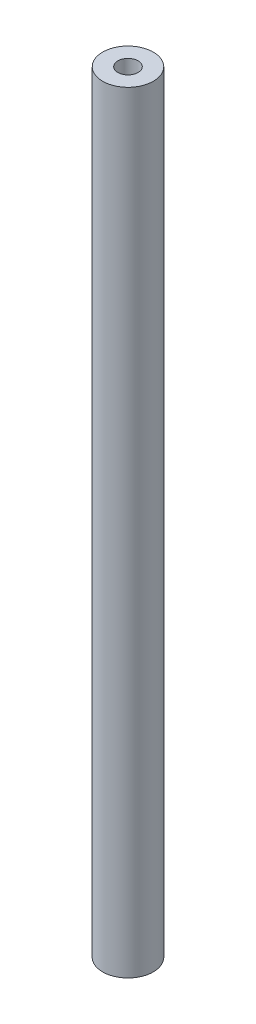
ISO-10303-21;
HEADER;
FILE_DESCRIPTION(('STEP AP214'),'2;1');
FILE_NAME('part.step','',(''),(''),'','','');
FILE_SCHEMA(('AUTOMOTIVE_DESIGN { 1 0 10303 214 1 1 1 1 }'));
ENDSEC;
DATA;
#1=APPLICATION_CONTEXT('core data for automotive mechanical design processes');
#2=APPLICATION_PROTOCOL_DEFINITION('international standard','automotive_design',2000,#1);
#3=PRODUCT_CONTEXT('',#1,'mechanical');
#4=PRODUCT('Part','Part','',(#3));
#5=PRODUCT_RELATED_PRODUCT_CATEGORY('part','',(#4));
#6=PRODUCT_DEFINITION_FORMATION('','',#4);
#7=PRODUCT_DEFINITION_CONTEXT('part definition',#1,'design');
#8=PRODUCT_DEFINITION('design','',#6,#7);
#9=PRODUCT_DEFINITION_SHAPE('','',#8);
#10=(LENGTH_UNIT() NAMED_UNIT(*) SI_UNIT(.MILLI.,.METRE.));
#11=(NAMED_UNIT(*) PLANE_ANGLE_UNIT() SI_UNIT($,.RADIAN.));
#12=(NAMED_UNIT(*) SI_UNIT($,.STERADIAN.) SOLID_ANGLE_UNIT());
#13=UNCERTAINTY_MEASURE_WITH_UNIT(LENGTH_MEASURE(1.E-05),#10,'distance_accuracy_value','');
#14=(GEOMETRIC_REPRESENTATION_CONTEXT(3) GLOBAL_UNCERTAINTY_ASSIGNED_CONTEXT((#13)) GLOBAL_UNIT_ASSIGNED_CONTEXT((#10,
#11,#12)) REPRESENTATION_CONTEXT('',''));
#15=CARTESIAN_POINT('',(0.,0.,0.));
#16=DIRECTION('',(0.,0.,1.));
#17=DIRECTION('',(1.,0.,0.));
#18=AXIS2_PLACEMENT_3D('',#15,#16,#17);
#19=CARTESIAN_POINT('',(0.,228.6,0.));
#20=DIRECTION('',(0.,1.,0.));
#21=DIRECTION('',(0.,0.,1.));
#22=AXIS2_PLACEMENT_3D('',#19,#20,#21);
#23=PLANE('',#22);
#24=CARTESIAN_POINT('',(0.,228.6,0.));
#25=DIRECTION('',(0.,1.,0.));
#26=DIRECTION('',(0.,0.,1.));
#27=AXIS2_PLACEMENT_3D('',#24,#25,#26);
#28=CIRCLE('',#27,15.);
#29=CARTESIAN_POINT('',(0.,228.6,15.));
#30=VERTEX_POINT('',#29);
#31=EDGE_CURVE('E10',#30,#30,#28,.T.);
#32=ORIENTED_EDGE('',*,*,#31,.T.);
#33=EDGE_LOOP('',(#32));
#34=FACE_BOUND('',#33,.T.);
#35=CARTESIAN_POINT('',(0.,228.6,0.));
#36=DIRECTION('',(0.,1.,0.));
#37=DIRECTION('',(0.,0.,1.));
#38=AXIS2_PLACEMENT_3D('',#35,#36,#37);
#39=CIRCLE('',#38,6.);
#40=CARTESIAN_POINT('',(0.,228.6,6.));
#41=VERTEX_POINT('',#40);
#42=EDGE_CURVE('E54',#41,#41,#39,.T.);
#43=ORIENTED_EDGE('',*,*,#42,.F.);
#44=EDGE_LOOP('',(#43));
#45=FACE_BOUND('',#44,.T.);
#46=ADVANCED_FACE('F41',(#34,#45),#23,.T.);
#47=CARTESIAN_POINT('',(0.,-228.6,0.));
#48=DIRECTION('',(0.,1.,0.));
#49=DIRECTION('',(0.,0.,1.));
#50=AXIS2_PLACEMENT_3D('',#47,#48,#49);
#51=PLANE('',#50);
#52=CARTESIAN_POINT('',(0.,-228.6,0.));
#53=DIRECTION('',(0.,1.,0.));
#54=DIRECTION('',(0.,0.,1.));
#55=AXIS2_PLACEMENT_3D('',#52,#53,#54);
#56=CIRCLE('',#55,15.);
#57=CARTESIAN_POINT('',(0.,-228.6,15.));
#58=VERTEX_POINT('',#57);
#59=EDGE_CURVE('E45',#58,#58,#56,.T.);
#60=ORIENTED_EDGE('',*,*,#59,.F.);
#61=EDGE_LOOP('',(#60));
#62=FACE_BOUND('',#61,.T.);
#63=CARTESIAN_POINT('',(0.,-228.6,0.));
#64=DIRECTION('',(0.,1.,0.));
#65=DIRECTION('',(0.,0.,1.));
#66=AXIS2_PLACEMENT_3D('',#63,#64,#65);
#67=CIRCLE('',#66,6.);
#68=CARTESIAN_POINT('',(0.,-228.6,6.));
#69=VERTEX_POINT('',#68);
#70=EDGE_CURVE('E56',#69,#69,#67,.T.);
#71=ORIENTED_EDGE('',*,*,#70,.T.);
#72=EDGE_LOOP('',(#71));
#73=FACE_BOUND('',#72,.T.);
#74=ADVANCED_FACE('F68',(#62,#73),#51,.F.);
#75=CARTESIAN_POINT('',(0.,228.6,0.));
#76=DIRECTION('',(0.,-1.,0.));
#77=DIRECTION('',(0.,0.,-1.));
#78=AXIS2_PLACEMENT_3D('',#75,#76,#77);
#79=CYLINDRICAL_SURFACE('',#78,15.);
#80=ORIENTED_EDGE('',*,*,#31,.F.);
#81=EDGE_LOOP('',(#80));
#82=FACE_BOUND('',#81,.T.);
#83=ORIENTED_EDGE('',*,*,#59,.T.);
#84=EDGE_LOOP('',(#83));
#85=FACE_BOUND('',#84,.T.);
#86=ADVANCED_FACE('F43',(#82,#85),#79,.T.);
#87=CARTESIAN_POINT('',(0.,228.6,0.));
#88=DIRECTION('',(0.,-1.,0.));
#89=DIRECTION('',(0.,0.,-1.));
#90=AXIS2_PLACEMENT_3D('',#87,#88,#89);
#91=CYLINDRICAL_SURFACE('',#90,6.);
#92=ORIENTED_EDGE('',*,*,#42,.T.);
#93=EDGE_LOOP('',(#92));
#94=FACE_BOUND('',#93,.T.);
#95=ORIENTED_EDGE('',*,*,#70,.F.);
#96=EDGE_LOOP('',(#95));
#97=FACE_BOUND('',#96,.T.);
#98=ADVANCED_FACE('F64',(#94,#97),#91,.F.);
#99=CLOSED_SHELL('',(#46,#74,#86,#98));
#100=MANIFOLD_SOLID_BREP('B2',#99);
#101=ADVANCED_BREP_SHAPE_REPRESENTATION('',(#18,#100),#14);
#102=SHAPE_DEFINITION_REPRESENTATION(#9,#101);
ENDSEC;
END-ISO-10303-21;
